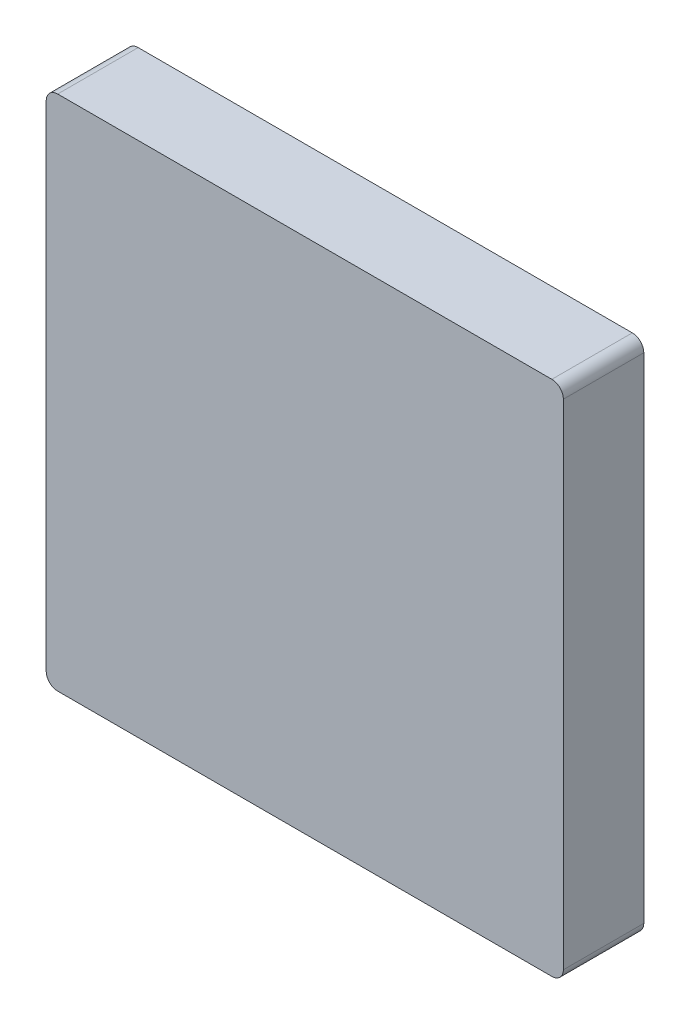
ISO-10303-21;
HEADER;
FILE_DESCRIPTION(('STEP AP214'),'2;1');
FILE_NAME('part.step','',(''),(''),'','','');
FILE_SCHEMA(('AUTOMOTIVE_DESIGN { 1 0 10303 214 1 1 1 1 }'));
ENDSEC;
DATA;
#1=APPLICATION_CONTEXT('core data for automotive mechanical design processes');
#2=APPLICATION_PROTOCOL_DEFINITION('international standard','automotive_design',2000,#1);
#3=PRODUCT_CONTEXT('',#1,'mechanical');
#4=PRODUCT('Part','Part','',(#3));
#5=PRODUCT_RELATED_PRODUCT_CATEGORY('part','',(#4));
#6=PRODUCT_DEFINITION_FORMATION('','',#4);
#7=PRODUCT_DEFINITION_CONTEXT('part definition',#1,'design');
#8=PRODUCT_DEFINITION('design','',#6,#7);
#9=PRODUCT_DEFINITION_SHAPE('','',#8);
#10=(LENGTH_UNIT() NAMED_UNIT(*) SI_UNIT(.MILLI.,.METRE.));
#11=(NAMED_UNIT(*) PLANE_ANGLE_UNIT() SI_UNIT($,.RADIAN.));
#12=(NAMED_UNIT(*) SI_UNIT($,.STERADIAN.) SOLID_ANGLE_UNIT());
#13=UNCERTAINTY_MEASURE_WITH_UNIT(LENGTH_MEASURE(1.E-05),#10,'distance_accuracy_value','');
#14=(GEOMETRIC_REPRESENTATION_CONTEXT(3) GLOBAL_UNCERTAINTY_ASSIGNED_CONTEXT((#13)) GLOBAL_UNIT_ASSIGNED_CONTEXT((#10,
#11,#12)) REPRESENTATION_CONTEXT('',''));
#15=CARTESIAN_POINT('',(0.,0.,0.));
#16=DIRECTION('',(0.,0.,1.));
#17=DIRECTION('',(1.,0.,0.));
#18=AXIS2_PLACEMENT_3D('',#15,#16,#17);
#19=CARTESIAN_POINT('',(-6.3378612716763,3.18236994219653,0.7));
#20=DIRECTION('',(0.,0.,-1.));
#21=DIRECTION('',(-1.,0.,0.));
#22=AXIS2_PLACEMENT_3D('',#19,#20,#21);
#23=CYLINDRICAL_SURFACE('',#22,0.1);
#24=CARTESIAN_POINT('',(-6.3378612716763,3.18236994219653,0.));
#25=DIRECTION('',(0.,0.,1.));
#26=DIRECTION('',(-1.,0.,0.));
#27=AXIS2_PLACEMENT_3D('',#24,#25,#26);
#28=CIRCLE('',#27,0.1);
#29=CARTESIAN_POINT('',(-6.4378612716763,3.18236994219653,0.));
#30=VERTEX_POINT('',#29);
#31=CARTESIAN_POINT('',(-6.3378612716763,3.08236994219653,0.));
#32=VERTEX_POINT('',#31);
#33=EDGE_CURVE('E130',#30,#32,#28,.T.);
#34=ORIENTED_EDGE('',*,*,#33,.T.);
#35=DIRECTION('',(0.,0.,-1.));
#36=VECTOR('',#35,1.);
#37=CARTESIAN_POINT('',(-6.3378612716763,3.08236994219653,0.7));
#38=LINE('',#37,#36);
#39=CARTESIAN_POINT('',(-6.3378612716763,3.08236994219653,0.7));
#40=VERTEX_POINT('',#39);
#41=EDGE_CURVE('E11',#40,#32,#38,.T.);
#42=ORIENTED_EDGE('',*,*,#41,.F.);
#43=CARTESIAN_POINT('',(-6.3378612716763,3.18236994219653,0.7));
#44=DIRECTION('',(0.,0.,1.));
#45=DIRECTION('',(-1.,0.,0.));
#46=AXIS2_PLACEMENT_3D('',#43,#44,#45);
#47=CIRCLE('',#46,0.1);
#48=CARTESIAN_POINT('',(-6.4378612716763,3.18236994219653,0.7));
#49=VERTEX_POINT('',#48);
#50=EDGE_CURVE('E144',#49,#40,#47,.T.);
#51=ORIENTED_EDGE('',*,*,#50,.F.);
#52=DIRECTION('',(0.,0.,-1.));
#53=VECTOR('',#52,1.);
#54=CARTESIAN_POINT('',(-6.4378612716763,3.18236994219653,0.7));
#55=LINE('',#54,#53);
#56=EDGE_CURVE('E126',#49,#30,#55,.T.);
#57=ORIENTED_EDGE('',*,*,#56,.T.);
#58=EDGE_LOOP('',(#34,#42,#51,#57));
#59=FACE_BOUND('',#58,.T.);
#60=ADVANCED_FACE('F34',(#59),#23,.T.);
#61=CARTESIAN_POINT('',(-6.3378612716763,3.08236994219653,0.7));
#62=DIRECTION('',(0.,1.,0.));
#63=DIRECTION('',(0.,0.,1.));
#64=AXIS2_PLACEMENT_3D('',#61,#62,#63);
#65=PLANE('',#64);
#66=DIRECTION('',(1.,0.,0.));
#67=VECTOR('',#66,1.);
#68=CARTESIAN_POINT('',(-6.3378612716763,3.08236994219653,0.));
#69=LINE('',#68,#67);
#70=CARTESIAN_POINT('',(-2.0378612716763,3.08236994219653,0.));
#71=VERTEX_POINT('',#70);
#72=EDGE_CURVE('E133',#32,#71,#69,.T.);
#73=ORIENTED_EDGE('',*,*,#72,.T.);
#74=DIRECTION('',(0.,0.,-1.));
#75=VECTOR('',#74,1.);
#76=CARTESIAN_POINT('',(-2.0378612716763,3.08236994219653,0.7));
#77=LINE('',#76,#75);
#78=CARTESIAN_POINT('',(-2.0378612716763,3.08236994219653,0.7));
#79=VERTEX_POINT('',#78);
#80=EDGE_CURVE('E42',#79,#71,#77,.T.);
#81=ORIENTED_EDGE('',*,*,#80,.F.);
#82=DIRECTION('',(1.,0.,0.));
#83=VECTOR('',#82,1.);
#84=CARTESIAN_POINT('',(-6.3378612716763,3.08236994219653,0.7));
#85=LINE('',#84,#83);
#86=EDGE_CURVE('E93',#40,#79,#85,.T.);
#87=ORIENTED_EDGE('',*,*,#86,.F.);
#88=ORIENTED_EDGE('',*,*,#41,.T.);
#89=EDGE_LOOP('',(#73,#81,#87,#88));
#90=FACE_BOUND('',#89,.T.);
#91=ADVANCED_FACE('F179',(#90),#65,.F.);
#92=CARTESIAN_POINT('',(-2.0378612716763,3.18236994219653,0.7));
#93=DIRECTION('',(0.,0.,-1.));
#94=DIRECTION('',(-1.,0.,0.));
#95=AXIS2_PLACEMENT_3D('',#92,#93,#94);
#96=CYLINDRICAL_SURFACE('',#95,0.0999999999999998);
#97=CARTESIAN_POINT('',(-2.0378612716763,3.18236994219653,0.));
#98=DIRECTION('',(0.,0.,1.));
#99=DIRECTION('',(-1.,0.,0.));
#100=AXIS2_PLACEMENT_3D('',#97,#98,#99);
#101=CIRCLE('',#100,0.0999999999999998);
#102=CARTESIAN_POINT('',(-1.9378612716763,3.18236994219653,0.));
#103=VERTEX_POINT('',#102);
#104=EDGE_CURVE('E135',#71,#103,#101,.T.);
#105=ORIENTED_EDGE('',*,*,#104,.T.);
#106=DIRECTION('',(0.,0.,-1.));
#107=VECTOR('',#106,1.);
#108=CARTESIAN_POINT('',(-1.9378612716763,3.18236994219653,0.7));
#109=LINE('',#108,#107);
#110=CARTESIAN_POINT('',(-1.9378612716763,3.18236994219653,0.7));
#111=VERTEX_POINT('',#110);
#112=EDGE_CURVE('E151',#111,#103,#109,.T.);
#113=ORIENTED_EDGE('',*,*,#112,.F.);
#114=CARTESIAN_POINT('',(-2.0378612716763,3.18236994219653,0.7));
#115=DIRECTION('',(0.,0.,1.));
#116=DIRECTION('',(-1.,0.,0.));
#117=AXIS2_PLACEMENT_3D('',#114,#115,#116);
#118=CIRCLE('',#117,0.0999999999999998);
#119=EDGE_CURVE('E159',#79,#111,#118,.T.);
#120=ORIENTED_EDGE('',*,*,#119,.F.);
#121=ORIENTED_EDGE('',*,*,#80,.T.);
#122=EDGE_LOOP('',(#105,#113,#120,#121));
#123=FACE_BOUND('',#122,.T.);
#124=ADVANCED_FACE('F157',(#123),#96,.T.);
#125=CARTESIAN_POINT('',(-1.9378612716763,7.48236994219653,0.7));
#126=DIRECTION('',(-1.,0.,0.));
#127=DIRECTION('',(0.,-1.,0.));
#128=AXIS2_PLACEMENT_3D('',#125,#126,#127);
#129=PLANE('',#128);
#130=DIRECTION('',(0.,1.,0.));
#131=VECTOR('',#130,1.);
#132=CARTESIAN_POINT('',(-1.9378612716763,7.48236994219653,0.));
#133=LINE('',#132,#131);
#134=CARTESIAN_POINT('',(-1.9378612716763,7.48236994219653,0.));
#135=VERTEX_POINT('',#134);
#136=EDGE_CURVE('E137',#103,#135,#133,.T.);
#137=ORIENTED_EDGE('',*,*,#136,.T.);
#138=DIRECTION('',(0.,0.,-1.));
#139=VECTOR('',#138,1.);
#140=CARTESIAN_POINT('',(-1.9378612716763,7.48236994219653,0.7));
#141=LINE('',#140,#139);
#142=CARTESIAN_POINT('',(-1.9378612716763,7.48236994219653,0.7));
#143=VERTEX_POINT('',#142);
#144=EDGE_CURVE('E148',#143,#135,#141,.T.);
#145=ORIENTED_EDGE('',*,*,#144,.F.);
#146=DIRECTION('',(0.,1.,0.));
#147=VECTOR('',#146,1.);
#148=CARTESIAN_POINT('',(-1.9378612716763,7.48236994219653,0.7));
#149=LINE('',#148,#147);
#150=EDGE_CURVE('E171',#111,#143,#149,.T.);
#151=ORIENTED_EDGE('',*,*,#150,.F.);
#152=ORIENTED_EDGE('',*,*,#112,.T.);
#153=EDGE_LOOP('',(#137,#145,#151,#152));
#154=FACE_BOUND('',#153,.T.);
#155=ADVANCED_FACE('F167',(#154),#129,.F.);
#156=CARTESIAN_POINT('',(-2.0378612716763,7.48236994219653,0.7));
#157=DIRECTION('',(0.,0.,-1.));
#158=DIRECTION('',(-1.,0.,0.));
#159=AXIS2_PLACEMENT_3D('',#156,#157,#158);
#160=CYLINDRICAL_SURFACE('',#159,0.1);
#161=CARTESIAN_POINT('',(-2.0378612716763,7.48236994219653,0.));
#162=DIRECTION('',(0.,0.,1.));
#163=DIRECTION('',(1.,0.,0.));
#164=AXIS2_PLACEMENT_3D('',#161,#162,#163);
#165=CIRCLE('',#164,0.1);
#166=CARTESIAN_POINT('',(-2.0378612716763,7.58236994219653,0.));
#167=VERTEX_POINT('',#166);
#168=EDGE_CURVE('E139',#135,#167,#165,.T.);
#169=ORIENTED_EDGE('',*,*,#168,.T.);
#170=DIRECTION('',(0.,0.,-1.));
#171=VECTOR('',#170,1.);
#172=CARTESIAN_POINT('',(-2.0378612716763,7.58236994219653,0.7));
#173=LINE('',#172,#171);
#174=CARTESIAN_POINT('',(-2.0378612716763,7.58236994219653,0.7));
#175=VERTEX_POINT('',#174);
#176=EDGE_CURVE('E121',#175,#167,#173,.T.);
#177=ORIENTED_EDGE('',*,*,#176,.F.);
#178=CARTESIAN_POINT('',(-2.0378612716763,7.48236994219653,0.7));
#179=DIRECTION('',(0.,0.,1.));
#180=DIRECTION('',(1.,0.,0.));
#181=AXIS2_PLACEMENT_3D('',#178,#179,#180);
#182=CIRCLE('',#181,0.1);
#183=EDGE_CURVE('E112',#143,#175,#182,.T.);
#184=ORIENTED_EDGE('',*,*,#183,.F.);
#185=ORIENTED_EDGE('',*,*,#144,.T.);
#186=EDGE_LOOP('',(#169,#177,#184,#185));
#187=FACE_BOUND('',#186,.T.);
#188=ADVANCED_FACE('F170',(#187),#160,.T.);
#189=CARTESIAN_POINT('',(-6.3378612716763,7.58236994219653,0.7));
#190=DIRECTION('',(0.,-1.,0.));
#191=DIRECTION('',(0.,0.,-1.));
#192=AXIS2_PLACEMENT_3D('',#189,#190,#191);
#193=PLANE('',#192);
#194=DIRECTION('',(-1.,0.,0.));
#195=VECTOR('',#194,1.);
#196=CARTESIAN_POINT('',(-6.3378612716763,7.58236994219653,0.));
#197=LINE('',#196,#195);
#198=CARTESIAN_POINT('',(-6.3378612716763,7.58236994219653,0.));
#199=VERTEX_POINT('',#198);
#200=EDGE_CURVE('E120',#167,#199,#197,.T.);
#201=ORIENTED_EDGE('',*,*,#200,.T.);
#202=DIRECTION('',(0.,0.,-1.));
#203=VECTOR('',#202,1.);
#204=CARTESIAN_POINT('',(-6.3378612716763,7.58236994219653,0.7));
#205=LINE('',#204,#203);
#206=CARTESIAN_POINT('',(-6.3378612716763,7.58236994219653,0.7));
#207=VERTEX_POINT('',#206);
#208=EDGE_CURVE('E117',#207,#199,#205,.T.);
#209=ORIENTED_EDGE('',*,*,#208,.F.);
#210=DIRECTION('',(-1.,0.,0.));
#211=VECTOR('',#210,1.);
#212=CARTESIAN_POINT('',(-6.3378612716763,7.58236994219653,0.7));
#213=LINE('',#212,#211);
#214=EDGE_CURVE('E106',#175,#207,#213,.T.);
#215=ORIENTED_EDGE('',*,*,#214,.F.);
#216=ORIENTED_EDGE('',*,*,#176,.T.);
#217=EDGE_LOOP('',(#201,#209,#215,#216));
#218=FACE_BOUND('',#217,.T.);
#219=ADVANCED_FACE('F118',(#218),#193,.F.);
#220=CARTESIAN_POINT('',(-6.3378612716763,7.48236994219653,0.7));
#221=DIRECTION('',(0.,0.,-1.));
#222=DIRECTION('',(-1.,0.,0.));
#223=AXIS2_PLACEMENT_3D('',#220,#221,#222);
#224=CYLINDRICAL_SURFACE('',#223,0.1);
#225=CARTESIAN_POINT('',(-6.3378612716763,7.48236994219653,0.));
#226=DIRECTION('',(0.,0.,1.));
#227=DIRECTION('',(1.,0.,0.));
#228=AXIS2_PLACEMENT_3D('',#225,#226,#227);
#229=CIRCLE('',#228,0.1);
#230=CARTESIAN_POINT('',(-6.4378612716763,7.48236994219653,0.));
#231=VERTEX_POINT('',#230);
#232=EDGE_CURVE('E79',#199,#231,#229,.T.);
#233=ORIENTED_EDGE('',*,*,#232,.T.);
#234=DIRECTION('',(0.,0.,-1.));
#235=VECTOR('',#234,1.);
#236=CARTESIAN_POINT('',(-6.4378612716763,7.48236994219653,0.7));
#237=LINE('',#236,#235);
#238=CARTESIAN_POINT('',(-6.4378612716763,7.48236994219653,0.7));
#239=VERTEX_POINT('',#238);
#240=EDGE_CURVE('E122',#239,#231,#237,.T.);
#241=ORIENTED_EDGE('',*,*,#240,.F.);
#242=CARTESIAN_POINT('',(-6.3378612716763,7.48236994219653,0.7));
#243=DIRECTION('',(0.,0.,1.));
#244=DIRECTION('',(1.,0.,0.));
#245=AXIS2_PLACEMENT_3D('',#242,#243,#244);
#246=CIRCLE('',#245,0.1);
#247=EDGE_CURVE('E110',#207,#239,#246,.T.);
#248=ORIENTED_EDGE('',*,*,#247,.F.);
#249=ORIENTED_EDGE('',*,*,#208,.T.);
#250=EDGE_LOOP('',(#233,#241,#248,#249));
#251=FACE_BOUND('',#250,.T.);
#252=ADVANCED_FACE('F124',(#251),#224,.T.);
#253=CARTESIAN_POINT('',(-6.4378612716763,7.48236994219653,0.7));
#254=DIRECTION('',(1.,0.,0.));
#255=DIRECTION('',(0.,1.,0.));
#256=AXIS2_PLACEMENT_3D('',#253,#254,#255);
#257=PLANE('',#256);
#258=DIRECTION('',(0.,-1.,0.));
#259=VECTOR('',#258,1.);
#260=CARTESIAN_POINT('',(-6.4378612716763,7.48236994219653,0.));
#261=LINE('',#260,#259);
#262=EDGE_CURVE('E85',#231,#30,#261,.T.);
#263=ORIENTED_EDGE('',*,*,#262,.T.);
#264=ORIENTED_EDGE('',*,*,#56,.F.);
#265=DIRECTION('',(0.,-1.,0.));
#266=VECTOR('',#265,1.);
#267=CARTESIAN_POINT('',(-6.4378612716763,7.48236994219653,0.7));
#268=LINE('',#267,#266);
#269=EDGE_CURVE('E50',#239,#49,#268,.T.);
#270=ORIENTED_EDGE('',*,*,#269,.F.);
#271=ORIENTED_EDGE('',*,*,#240,.T.);
#272=EDGE_LOOP('',(#263,#264,#270,#271));
#273=FACE_BOUND('',#272,.T.);
#274=ADVANCED_FACE('F195',(#273),#257,.F.);
#275=CARTESIAN_POINT('',(-6.3378612716763,3.18236994219653,0.7));
#276=DIRECTION('',(0.,0.,-1.));
#277=DIRECTION('',(-1.,0.,0.));
#278=AXIS2_PLACEMENT_3D('',#275,#276,#277);
#279=PLANE('',#278);
#280=ORIENTED_EDGE('',*,*,#50,.T.);
#281=ORIENTED_EDGE('',*,*,#86,.T.);
#282=ORIENTED_EDGE('',*,*,#119,.T.);
#283=ORIENTED_EDGE('',*,*,#150,.T.);
#284=ORIENTED_EDGE('',*,*,#183,.T.);
#285=ORIENTED_EDGE('',*,*,#214,.T.);
#286=ORIENTED_EDGE('',*,*,#247,.T.);
#287=ORIENTED_EDGE('',*,*,#269,.T.);
#288=EDGE_LOOP('',(#280,#281,#282,#283,#284,#285,#286,#287));
#289=FACE_BOUND('',#288,.T.);
#290=ADVANCED_FACE('F108',(#289),#279,.F.);
#291=CARTESIAN_POINT('',(-6.3378612716763,3.18236994219653,0.));
#292=DIRECTION('',(0.,0.,-1.));
#293=DIRECTION('',(-1.,0.,0.));
#294=AXIS2_PLACEMENT_3D('',#291,#292,#293);
#295=PLANE('',#294);
#296=ORIENTED_EDGE('',*,*,#33,.F.);
#297=ORIENTED_EDGE('',*,*,#262,.F.);
#298=ORIENTED_EDGE('',*,*,#232,.F.);
#299=ORIENTED_EDGE('',*,*,#200,.F.);
#300=ORIENTED_EDGE('',*,*,#168,.F.);
#301=ORIENTED_EDGE('',*,*,#136,.F.);
#302=ORIENTED_EDGE('',*,*,#104,.F.);
#303=ORIENTED_EDGE('',*,*,#72,.F.);
#304=EDGE_LOOP('',(#296,#297,#298,#299,#300,#301,#302,#303));
#305=FACE_BOUND('',#304,.T.);
#306=ADVANCED_FACE('F163',(#305),#295,.T.);
#307=CLOSED_SHELL('',(#60,#91,#124,#155,#188,#219,#252,#274,#290,#306));
#308=MANIFOLD_SOLID_BREP('B2',#307);
#309=ADVANCED_BREP_SHAPE_REPRESENTATION('',(#18,#308),#14);
#310=SHAPE_DEFINITION_REPRESENTATION(#9,#309);
ENDSEC;
END-ISO-10303-21;
